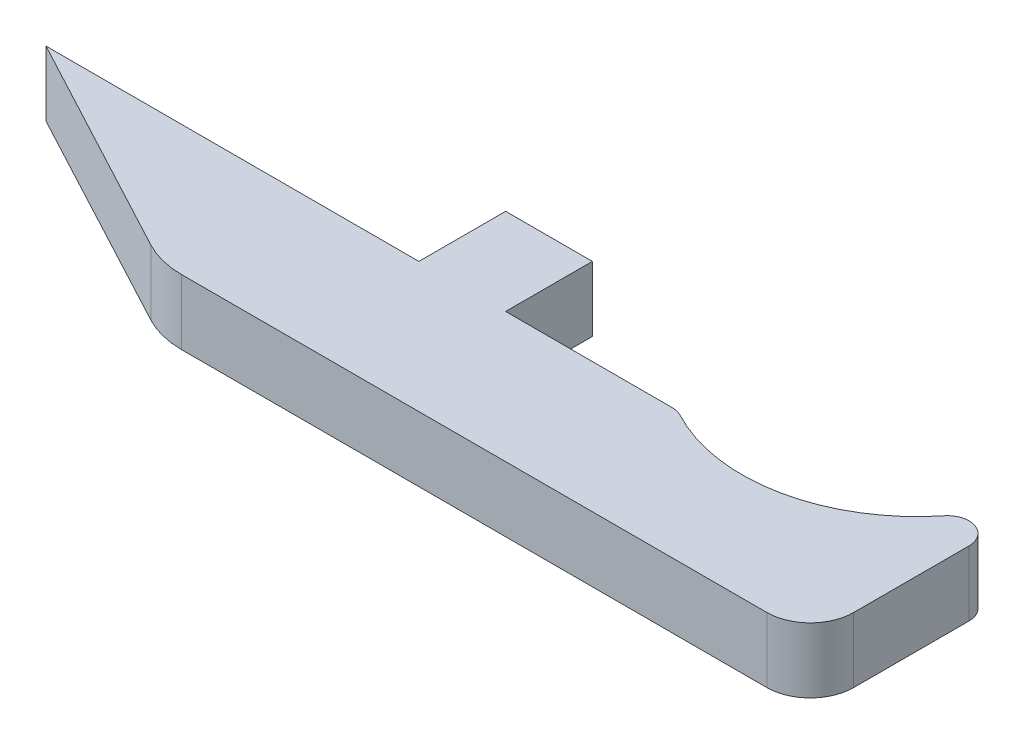
ISO-10303-21;
HEADER;
FILE_DESCRIPTION(('STEP AP214'),'2;1');
FILE_NAME('part.step','',(''),(''),'','','');
FILE_SCHEMA(('AUTOMOTIVE_DESIGN { 1 0 10303 214 1 1 1 1 }'));
ENDSEC;
DATA;
#1=APPLICATION_CONTEXT('core data for automotive mechanical design processes');
#2=APPLICATION_PROTOCOL_DEFINITION('international standard','automotive_design',2000,#1);
#3=PRODUCT_CONTEXT('',#1,'mechanical');
#4=PRODUCT('Part','Part','',(#3));
#5=PRODUCT_RELATED_PRODUCT_CATEGORY('part','',(#4));
#6=PRODUCT_DEFINITION_FORMATION('','',#4);
#7=PRODUCT_DEFINITION_CONTEXT('part definition',#1,'design');
#8=PRODUCT_DEFINITION('design','',#6,#7);
#9=PRODUCT_DEFINITION_SHAPE('','',#8);
#10=(LENGTH_UNIT() NAMED_UNIT(*) SI_UNIT(.MILLI.,.METRE.));
#11=(NAMED_UNIT(*) PLANE_ANGLE_UNIT() SI_UNIT($,.RADIAN.));
#12=(NAMED_UNIT(*) SI_UNIT($,.STERADIAN.) SOLID_ANGLE_UNIT());
#13=UNCERTAINTY_MEASURE_WITH_UNIT(LENGTH_MEASURE(1.E-05),#10,'distance_accuracy_value','');
#14=(GEOMETRIC_REPRESENTATION_CONTEXT(3) GLOBAL_UNCERTAINTY_ASSIGNED_CONTEXT((#13)) GLOBAL_UNIT_ASSIGNED_CONTEXT((#10,
#11,#12)) REPRESENTATION_CONTEXT('',''));
#15=CARTESIAN_POINT('',(0.,0.,0.));
#16=DIRECTION('',(0.,0.,1.));
#17=DIRECTION('',(1.,0.,0.));
#18=AXIS2_PLACEMENT_3D('',#15,#16,#17);
#19=CARTESIAN_POINT('',(0.,4.7625,45.8687309916866));
#20=DIRECTION('',(0.,0.,1.));
#21=DIRECTION('',(1.,0.,0.));
#22=AXIS2_PLACEMENT_3D('',#19,#20,#21);
#23=PLANE('',#22);
#24=DIRECTION('',(0.,-1.,0.));
#25=VECTOR('',#24,1.);
#26=CARTESIAN_POINT('',(39.9394999999324,4.7625,45.8687309916866));
#27=LINE('',#26,#25);
#28=CARTESIAN_POINT('',(39.9394999999324,4.7625,45.8687309916866));
#29=VERTEX_POINT('',#28);
#30=CARTESIAN_POINT('',(39.9394999999324,0.,45.8687309916866));
#31=VERTEX_POINT('',#30);
#32=EDGE_CURVE('E66',#29,#31,#27,.T.);
#33=ORIENTED_EDGE('',*,*,#32,.F.);
#34=DIRECTION('',(-1.,0.,0.));
#35=VECTOR('',#34,1.);
#36=CARTESIAN_POINT('',(0.,4.7625,45.8687309916866));
#37=LINE('',#36,#35);
#38=CARTESIAN_POINT('',(52.1487518651009,4.7625,45.8687309916866));
#39=VERTEX_POINT('',#38);
#40=EDGE_CURVE('E176',#39,#29,#37,.T.);
#41=ORIENTED_EDGE('',*,*,#40,.F.);
#42=DIRECTION('',(0.,1.,0.));
#43=VECTOR('',#42,1.);
#44=CARTESIAN_POINT('',(52.1487518651009,0.,45.8687309916866));
#45=LINE('',#44,#43);
#46=CARTESIAN_POINT('',(52.1487518651009,0.,45.8687309916866));
#47=VERTEX_POINT('',#46);
#48=EDGE_CURVE('E199',#39,#47,#45,.F.);
#49=ORIENTED_EDGE('',*,*,#48,.T.);
#50=DIRECTION('',(-1.,0.,0.));
#51=VECTOR('',#50,1.);
#52=CARTESIAN_POINT('',(0.,0.,45.8687309916866));
#53=LINE('',#52,#51);
#54=EDGE_CURVE('E188',#47,#31,#53,.T.);
#55=ORIENTED_EDGE('',*,*,#54,.T.);
#56=EDGE_LOOP('',(#33,#41,#49,#55));
#57=FACE_BOUND('',#56,.T.);
#58=ADVANCED_FACE('F43',(#57),#23,.F.);
#59=DIRECTION('',(0.,1.,0.));
#60=VECTOR('',#59,1.);
#61=CARTESIAN_POINT('',(33.5894999999324,4.7625,45.8687309916866));
#62=LINE('',#61,#60);
#63=CARTESIAN_POINT('',(33.5894999999324,0.,45.8687309916866));
#64=VERTEX_POINT('',#63);
#65=CARTESIAN_POINT('',(33.5894999999324,4.7625,45.8687309916866));
#66=VERTEX_POINT('',#65);
#67=EDGE_CURVE('E160',#64,#66,#62,.T.);
#68=ORIENTED_EDGE('',*,*,#67,.F.);
#69=CARTESIAN_POINT('',(6.28449999993243,0.,45.8687309916866));
#70=VERTEX_POINT('',#69);
#71=EDGE_CURVE('E166',#64,#70,#53,.T.);
#72=ORIENTED_EDGE('',*,*,#71,.T.);
#73=DIRECTION('',(0.,-1.,0.));
#74=VECTOR('',#73,1.);
#75=CARTESIAN_POINT('',(6.28449999993243,4.7625,45.8687309916866));
#76=LINE('',#75,#74);
#77=CARTESIAN_POINT('',(6.28449999993243,4.7625,45.8687309916866));
#78=VERTEX_POINT('',#77);
#79=EDGE_CURVE('E186',#78,#70,#76,.T.);
#80=ORIENTED_EDGE('',*,*,#79,.F.);
#81=EDGE_CURVE('E58',#66,#78,#37,.T.);
#82=ORIENTED_EDGE('',*,*,#81,.F.);
#83=EDGE_LOOP('',(#68,#72,#80,#82));
#84=FACE_BOUND('',#83,.T.);
#85=ADVANCED_FACE('F271',(#84),#23,.F.);
#86=CARTESIAN_POINT('',(58.9432399959317,4.7625,34.7435309916866));
#87=DIRECTION('',(0.,-1.,0.));
#88=DIRECTION('',(0.,0.,-1.));
#89=AXIS2_PLACEMENT_3D('',#86,#87,#88);
#90=CYLINDRICAL_SURFACE('',#89,12.827);
#91=CARTESIAN_POINT('',(58.9432399959317,0.,34.7435309916866));
#92=DIRECTION('',(0.,1.,0.));
#93=DIRECTION('',(0.,0.,1.));
#94=AXIS2_PLACEMENT_3D('',#91,#92,#93);
#95=CIRCLE('',#94,12.827);
#96=CARTESIAN_POINT('',(52.8970435094656,0.,46.0561538991756));
#97=VERTEX_POINT('',#96);
#98=CARTESIAN_POINT('',(68.944909599456,0.,42.774628932936));
#99=VERTEX_POINT('',#98);
#100=EDGE_CURVE('E163',#97,#99,#95,.T.);
#101=ORIENTED_EDGE('',*,*,#100,.F.);
#102=DIRECTION('',(0.,-1.,0.));
#103=VECTOR('',#102,1.);
#104=CARTESIAN_POINT('',(52.8970435094656,4.7625,46.0561538991756));
#105=LINE('',#104,#103);
#106=CARTESIAN_POINT('',(52.8970435094656,4.7625,46.0561538991756));
#107=VERTEX_POINT('',#106);
#108=EDGE_CURVE('E209',#97,#107,#105,.F.);
#109=ORIENTED_EDGE('',*,*,#108,.T.);
#110=CARTESIAN_POINT('',(58.9432399959317,4.7625,34.7435309916866));
#111=DIRECTION('',(0.,1.,0.));
#112=DIRECTION('',(0.,0.,1.));
#113=AXIS2_PLACEMENT_3D('',#110,#111,#112);
#114=CIRCLE('',#113,12.827);
#115=CARTESIAN_POINT('',(68.944909599456,4.7625,42.774628932936));
#116=VERTEX_POINT('',#115);
#117=EDGE_CURVE('E172',#107,#116,#114,.T.);
#118=ORIENTED_EDGE('',*,*,#117,.T.);
#119=DIRECTION('',(0.,-1.,0.));
#120=VECTOR('',#119,1.);
#121=CARTESIAN_POINT('',(68.944909599456,4.7625,42.774628932936));
#122=LINE('',#121,#120);
#123=EDGE_CURVE('E206',#116,#99,#122,.T.);
#124=ORIENTED_EDGE('',*,*,#123,.T.);
#125=EDGE_LOOP('',(#101,#109,#118,#124));
#126=FACE_BOUND('',#125,.T.);
#127=ADVANCED_FACE('F253',(#126),#90,.F.);
#128=CARTESIAN_POINT('',(-17.653471350339,4.7625,33.1027886420187));
#129=DIRECTION('',(0.470560234606516,0.,-0.88236787430587));
#130=DIRECTION('',(-0.88236787430587,0.,-0.470560234606516));
#131=AXIS2_PLACEMENT_3D('',#128,#129,#130);
#132=PLANE('',#131);
#133=DIRECTION('',(0.88236787430587,0.,0.470560234606516));
#134=VECTOR('',#133,1.);
#135=CARTESIAN_POINT('',(-17.653471350339,0.,33.1027886420187));
#136=LINE('',#135,#134);
#137=CARTESIAN_POINT('',(22.7445754544654,0.,54.6467669935289));
#138=VERTEX_POINT('',#137);
#139=EDGE_CURVE('E190',#70,#138,#136,.T.);
#140=ORIENTED_EDGE('',*,*,#139,.T.);
#141=DIRECTION('',(0.,-1.,0.));
#142=VECTOR('',#141,1.);
#143=CARTESIAN_POINT('',(22.7445754544654,4.7625,54.6467669935289));
#144=LINE('',#143,#142);
#145=CARTESIAN_POINT('',(22.7445754544654,4.7625,54.6467669935289));
#146=VERTEX_POINT('',#145);
#147=EDGE_CURVE('E222',#138,#146,#144,.F.);
#148=ORIENTED_EDGE('',*,*,#147,.T.);
#149=DIRECTION('',(0.88236787430587,0.,0.470560234606516));
#150=VECTOR('',#149,1.);
#151=CARTESIAN_POINT('',(-17.653471350339,4.7625,33.1027886420187));
#152=LINE('',#151,#150);
#153=EDGE_CURVE('E178',#78,#146,#152,.T.);
#154=ORIENTED_EDGE('',*,*,#153,.F.);
#155=ORIENTED_EDGE('',*,*,#79,.T.);
#156=EDGE_LOOP('',(#140,#148,#154,#155));
#157=FACE_BOUND('',#156,.T.);
#158=ADVANCED_FACE('F274',(#157),#132,.F.);
#159=CARTESIAN_POINT('',(0.,4.7625,55.3937309916866));
#160=DIRECTION('',(0.,0.,-1.));
#161=DIRECTION('',(-1.,0.,0.));
#162=AXIS2_PLACEMENT_3D('',#159,#160,#161);
#163=PLANE('',#162);
#164=DIRECTION('',(1.,0.,0.));
#165=VECTOR('',#164,1.);
#166=CARTESIAN_POINT('',(0.,0.,55.3937309916866));
#167=LINE('',#166,#165);
#168=CARTESIAN_POINT('',(25.7326329442167,0.,55.3937309916866));
#169=VERTEX_POINT('',#168);
#170=CARTESIAN_POINT('',(68.5952399959317,0.,55.3937309916866));
#171=VERTEX_POINT('',#170);
#172=EDGE_CURVE('E193',#169,#171,#167,.T.);
#173=ORIENTED_EDGE('',*,*,#172,.T.);
#174=DIRECTION('',(0.,-1.,0.));
#175=VECTOR('',#174,1.);
#176=CARTESIAN_POINT('',(68.5952399959317,4.7625,55.3937309916866));
#177=LINE('',#176,#175);
#178=CARTESIAN_POINT('',(68.5952399959317,4.7625,55.3937309916866));
#179=VERTEX_POINT('',#178);
#180=EDGE_CURVE('E51',#171,#179,#177,.F.);
#181=ORIENTED_EDGE('',*,*,#180,.T.);
#182=DIRECTION('',(1.,0.,0.));
#183=VECTOR('',#182,1.);
#184=CARTESIAN_POINT('',(0.,4.7625,55.3937309916866));
#185=LINE('',#184,#183);
#186=CARTESIAN_POINT('',(25.7326329442167,4.7625,55.3937309916866));
#187=VERTEX_POINT('',#186);
#188=EDGE_CURVE('E181',#187,#179,#185,.T.);
#189=ORIENTED_EDGE('',*,*,#188,.F.);
#190=DIRECTION('',(0.,-1.,0.));
#191=VECTOR('',#190,1.);
#192=CARTESIAN_POINT('',(25.7326329442167,4.7625,55.3937309916866));
#193=LINE('',#192,#191);
#194=EDGE_CURVE('E217',#187,#169,#193,.T.);
#195=ORIENTED_EDGE('',*,*,#194,.T.);
#196=EDGE_LOOP('',(#173,#181,#189,#195));
#197=FACE_BOUND('',#196,.T.);
#198=ADVANCED_FACE('F233',(#197),#163,.F.);
#199=CARTESIAN_POINT('',(71.7702399959317,4.7625,0.));
#200=DIRECTION('',(1.,0.,0.));
#201=DIRECTION('',(0.,0.,-1.));
#202=AXIS2_PLACEMENT_3D('',#199,#200,#201);
#203=PLANE('',#202);
#204=DIRECTION('',(0.,0.,1.));
#205=VECTOR('',#204,1.);
#206=CARTESIAN_POINT('',(71.7702399959317,4.7625,0.));
#207=LINE('',#206,#205);
#208=CARTESIAN_POINT('',(71.7702399959317,4.7625,43.7685766979421));
#209=VERTEX_POINT('',#208);
#210=CARTESIAN_POINT('',(71.7702399959317,4.7625,52.2187309916866));
#211=VERTEX_POINT('',#210);
#212=EDGE_CURVE('E184',#209,#211,#207,.T.);
#213=ORIENTED_EDGE('',*,*,#212,.T.);
#214=DIRECTION('',(0.,-1.,0.));
#215=VECTOR('',#214,1.);
#216=CARTESIAN_POINT('',(71.7702399959317,0.,52.2187309916866));
#217=LINE('',#216,#215);
#218=CARTESIAN_POINT('',(71.7702399959317,0.,52.2187309916866));
#219=VERTEX_POINT('',#218);
#220=EDGE_CURVE('E226',#211,#219,#217,.T.);
#221=ORIENTED_EDGE('',*,*,#220,.T.);
#222=DIRECTION('',(0.,0.,1.));
#223=VECTOR('',#222,1.);
#224=CARTESIAN_POINT('',(71.7702399959317,0.,0.));
#225=LINE('',#224,#223);
#226=CARTESIAN_POINT('',(71.7702399959317,0.,43.7685766979421));
#227=VERTEX_POINT('',#226);
#228=EDGE_CURVE('E175',#227,#219,#225,.T.);
#229=ORIENTED_EDGE('',*,*,#228,.F.);
#230=DIRECTION('',(0.,-1.,0.));
#231=VECTOR('',#230,1.);
#232=CARTESIAN_POINT('',(71.7702399959317,4.7625,43.7685766979421));
#233=LINE('',#232,#231);
#234=EDGE_CURVE('E215',#227,#209,#233,.F.);
#235=ORIENTED_EDGE('',*,*,#234,.T.);
#236=EDGE_LOOP('',(#213,#221,#229,#235));
#237=FACE_BOUND('',#236,.T.);
#238=ADVANCED_FACE('F245',(#237),#203,.T.);
#239=CARTESIAN_POINT('',(0.,4.7625,0.));
#240=DIRECTION('',(0.,1.,0.));
#241=DIRECTION('',(0.,0.,1.));
#242=AXIS2_PLACEMENT_3D('',#239,#240,#241);
#243=PLANE('',#242);
#244=ORIENTED_EDGE('',*,*,#188,.T.);
#245=CARTESIAN_POINT('',(68.5952399959317,4.7625,52.2187309916866));
#246=DIRECTION('',(0.,1.,0.));
#247=DIRECTION('',(0.,0.,1.));
#248=AXIS2_PLACEMENT_3D('',#245,#246,#247);
#249=CIRCLE('',#248,3.175);
#250=EDGE_CURVE('E11',#179,#211,#249,.T.);
#251=ORIENTED_EDGE('',*,*,#250,.T.);
#252=ORIENTED_EDGE('',*,*,#212,.F.);
#253=CARTESIAN_POINT('',(70.1827399959317,4.7625,43.7685766979421));
#254=DIRECTION('',(0.,1.,0.));
#255=DIRECTION('',(0.,0.,1.));
#256=AXIS2_PLACEMENT_3D('',#253,#254,#255);
#257=CIRCLE('',#256,1.5875);
#258=EDGE_CURVE('E211',#209,#116,#257,.T.);
#259=ORIENTED_EDGE('',*,*,#258,.T.);
#260=ORIENTED_EDGE('',*,*,#117,.F.);
#261=CARTESIAN_POINT('',(52.1487518651009,4.7625,47.4562309916866));
#262=DIRECTION('',(0.,1.,0.));
#263=DIRECTION('',(0.,0.,1.));
#264=AXIS2_PLACEMENT_3D('',#261,#262,#263);
#265=CIRCLE('',#264,1.5875);
#266=EDGE_CURVE('E213',#107,#39,#265,.T.);
#267=ORIENTED_EDGE('',*,*,#266,.T.);
#268=ORIENTED_EDGE('',*,*,#40,.T.);
#269=DIRECTION('',(0.,0.,1.));
#270=VECTOR('',#269,1.);
#271=CARTESIAN_POINT('',(39.9394999999324,4.7625,39.5187309916866));
#272=LINE('',#271,#270);
#273=CARTESIAN_POINT('',(39.9394999999324,4.7625,39.5187309916866));
#274=VERTEX_POINT('',#273);
#275=EDGE_CURVE('E260',#274,#29,#272,.T.);
#276=ORIENTED_EDGE('',*,*,#275,.F.);
#277=DIRECTION('',(1.,0.,0.));
#278=VECTOR('',#277,1.);
#279=CARTESIAN_POINT('',(39.9394999999324,4.7625,39.5187309916866));
#280=LINE('',#279,#278);
#281=CARTESIAN_POINT('',(33.5894999999324,4.7625,39.5187309916866));
#282=VERTEX_POINT('',#281);
#283=EDGE_CURVE('E156',#282,#274,#280,.T.);
#284=ORIENTED_EDGE('',*,*,#283,.F.);
#285=DIRECTION('',(0.,0.,1.));
#286=VECTOR('',#285,1.);
#287=CARTESIAN_POINT('',(33.5894999999324,4.7625,39.5187309916866));
#288=LINE('',#287,#286);
#289=EDGE_CURVE('E168',#282,#66,#288,.T.);
#290=ORIENTED_EDGE('',*,*,#289,.T.);
#291=ORIENTED_EDGE('',*,*,#81,.T.);
#292=ORIENTED_EDGE('',*,*,#153,.T.);
#293=CARTESIAN_POINT('',(25.7326329442167,4.7625,49.0437309916866));
#294=DIRECTION('',(0.,1.,0.));
#295=DIRECTION('',(0.,0.,1.));
#296=AXIS2_PLACEMENT_3D('',#293,#294,#295);
#297=CIRCLE('',#296,6.35);
#298=EDGE_CURVE('E224',#146,#187,#297,.T.);
#299=ORIENTED_EDGE('',*,*,#298,.T.);
#300=EDGE_LOOP('',(#244,#251,#252,#259,#260,#267,#268,#276,#284,#290,#291,#292,#299));
#301=FACE_BOUND('',#300,.T.);
#302=ADVANCED_FACE('F239',(#301),#243,.T.);
#303=CARTESIAN_POINT('',(0.,0.,0.));
#304=DIRECTION('',(0.,1.,0.));
#305=DIRECTION('',(0.,0.,1.));
#306=AXIS2_PLACEMENT_3D('',#303,#304,#305);
#307=PLANE('',#306);
#308=ORIENTED_EDGE('',*,*,#228,.T.);
#309=CARTESIAN_POINT('',(68.5952399959317,0.,52.2187309916866));
#310=DIRECTION('',(0.,1.,0.));
#311=DIRECTION('',(0.,0.,1.));
#312=AXIS2_PLACEMENT_3D('',#309,#310,#311);
#313=CIRCLE('',#312,3.175);
#314=EDGE_CURVE('E229',#219,#171,#313,.F.);
#315=ORIENTED_EDGE('',*,*,#314,.T.);
#316=ORIENTED_EDGE('',*,*,#172,.F.);
#317=CARTESIAN_POINT('',(25.7326329442167,0.,49.0437309916866));
#318=DIRECTION('',(0.,1.,0.));
#319=DIRECTION('',(0.,0.,1.));
#320=AXIS2_PLACEMENT_3D('',#317,#318,#319);
#321=CIRCLE('',#320,6.35);
#322=EDGE_CURVE('E220',#169,#138,#321,.F.);
#323=ORIENTED_EDGE('',*,*,#322,.T.);
#324=ORIENTED_EDGE('',*,*,#139,.F.);
#325=ORIENTED_EDGE('',*,*,#71,.F.);
#326=DIRECTION('',(0.,0.,1.));
#327=VECTOR('',#326,1.);
#328=CARTESIAN_POINT('',(33.5894999999324,0.,39.5187309916866));
#329=LINE('',#328,#327);
#330=CARTESIAN_POINT('',(33.5894999999324,0.,39.5187309916866));
#331=VERTEX_POINT('',#330);
#332=EDGE_CURVE('E147',#331,#64,#329,.T.);
#333=ORIENTED_EDGE('',*,*,#332,.F.);
#334=DIRECTION('',(-1.,0.,0.));
#335=VECTOR('',#334,1.);
#336=CARTESIAN_POINT('',(39.9394999999324,0.,39.5187309916866));
#337=LINE('',#336,#335);
#338=CARTESIAN_POINT('',(39.9394999999324,0.,39.5187309916866));
#339=VERTEX_POINT('',#338);
#340=EDGE_CURVE('E139',#339,#331,#337,.T.);
#341=ORIENTED_EDGE('',*,*,#340,.F.);
#342=DIRECTION('',(0.,0.,1.));
#343=VECTOR('',#342,1.);
#344=CARTESIAN_POINT('',(39.9394999999324,0.,39.5187309916866));
#345=LINE('',#344,#343);
#346=EDGE_CURVE('E145',#339,#31,#345,.T.);
#347=ORIENTED_EDGE('',*,*,#346,.T.);
#348=ORIENTED_EDGE('',*,*,#54,.F.);
#349=CARTESIAN_POINT('',(52.1487518651009,0.,47.4562309916866));
#350=DIRECTION('',(0.,1.,0.));
#351=DIRECTION('',(0.,0.,1.));
#352=AXIS2_PLACEMENT_3D('',#349,#350,#351);
#353=CIRCLE('',#352,1.5875);
#354=EDGE_CURVE('E204',#47,#97,#353,.F.);
#355=ORIENTED_EDGE('',*,*,#354,.T.);
#356=ORIENTED_EDGE('',*,*,#100,.T.);
#357=CARTESIAN_POINT('',(70.1827399959317,0.,43.7685766979421));
#358=DIRECTION('',(0.,1.,0.));
#359=DIRECTION('',(0.,0.,1.));
#360=AXIS2_PLACEMENT_3D('',#357,#358,#359);
#361=CIRCLE('',#360,1.5875);
#362=EDGE_CURVE('E202',#99,#227,#361,.F.);
#363=ORIENTED_EDGE('',*,*,#362,.T.);
#364=EDGE_LOOP('',(#308,#315,#316,#323,#324,#325,#333,#341,#347,#348,#355,#356,#363));
#365=FACE_BOUND('',#364,.T.);
#366=ADVANCED_FACE('F142',(#365),#307,.F.);
#367=CARTESIAN_POINT('',(52.1487518651009,4.7625,47.4562309916866));
#368=DIRECTION('',(0.,-1.,0.));
#369=DIRECTION('',(0.,0.,-1.));
#370=AXIS2_PLACEMENT_3D('',#367,#368,#369);
#371=CYLINDRICAL_SURFACE('',#370,1.5875);
#372=ORIENTED_EDGE('',*,*,#266,.F.);
#373=ORIENTED_EDGE('',*,*,#108,.F.);
#374=ORIENTED_EDGE('',*,*,#354,.F.);
#375=ORIENTED_EDGE('',*,*,#48,.F.);
#376=EDGE_LOOP('',(#372,#373,#374,#375));
#377=FACE_BOUND('',#376,.T.);
#378=ADVANCED_FACE('F259',(#377),#371,.T.);
#379=CARTESIAN_POINT('',(70.1827399959317,4.7625,43.7685766979421));
#380=DIRECTION('',(0.,-1.,0.));
#381=DIRECTION('',(0.,0.,-1.));
#382=AXIS2_PLACEMENT_3D('',#379,#380,#381);
#383=CYLINDRICAL_SURFACE('',#382,1.5875);
#384=ORIENTED_EDGE('',*,*,#258,.F.);
#385=ORIENTED_EDGE('',*,*,#234,.F.);
#386=ORIENTED_EDGE('',*,*,#362,.F.);
#387=ORIENTED_EDGE('',*,*,#123,.F.);
#388=EDGE_LOOP('',(#384,#385,#386,#387));
#389=FACE_BOUND('',#388,.T.);
#390=ADVANCED_FACE('F251',(#389),#383,.T.);
#391=CARTESIAN_POINT('',(25.7326329442167,4.7625,49.0437309916866));
#392=DIRECTION('',(0.,-1.,0.));
#393=DIRECTION('',(0.,0.,-1.));
#394=AXIS2_PLACEMENT_3D('',#391,#392,#393);
#395=CYLINDRICAL_SURFACE('',#394,6.35);
#396=ORIENTED_EDGE('',*,*,#298,.F.);
#397=ORIENTED_EDGE('',*,*,#147,.F.);
#398=ORIENTED_EDGE('',*,*,#322,.F.);
#399=ORIENTED_EDGE('',*,*,#194,.F.);
#400=EDGE_LOOP('',(#396,#397,#398,#399));
#401=FACE_BOUND('',#400,.T.);
#402=ADVANCED_FACE('F277',(#401),#395,.T.);
#403=CARTESIAN_POINT('',(68.5952399959317,4.7625,52.2187309916866));
#404=DIRECTION('',(0.,1.,0.));
#405=DIRECTION('',(0.,0.,1.));
#406=AXIS2_PLACEMENT_3D('',#403,#404,#405);
#407=CYLINDRICAL_SURFACE('',#406,3.175);
#408=ORIENTED_EDGE('',*,*,#250,.F.);
#409=ORIENTED_EDGE('',*,*,#180,.F.);
#410=ORIENTED_EDGE('',*,*,#314,.F.);
#411=ORIENTED_EDGE('',*,*,#220,.F.);
#412=EDGE_LOOP('',(#408,#409,#410,#411));
#413=FACE_BOUND('',#412,.T.);
#414=ADVANCED_FACE('F45',(#413),#407,.T.);
#415=CARTESIAN_POINT('',(39.9394999999324,4.7625,39.5187309916866));
#416=DIRECTION('',(-1.,0.,0.));
#417=DIRECTION('',(0.,0.,1.));
#418=AXIS2_PLACEMENT_3D('',#415,#416,#417);
#419=PLANE('',#418);
#420=ORIENTED_EDGE('',*,*,#32,.T.);
#421=ORIENTED_EDGE('',*,*,#346,.F.);
#422=DIRECTION('',(0.,-1.,0.));
#423=VECTOR('',#422,1.);
#424=CARTESIAN_POINT('',(39.9394999999324,4.7625,39.5187309916866));
#425=LINE('',#424,#423);
#426=EDGE_CURVE('E151',#274,#339,#425,.T.);
#427=ORIENTED_EDGE('',*,*,#426,.F.);
#428=ORIENTED_EDGE('',*,*,#275,.T.);
#429=EDGE_LOOP('',(#420,#421,#427,#428));
#430=FACE_BOUND('',#429,.T.);
#431=ADVANCED_FACE('F162',(#430),#419,.F.);
#432=CARTESIAN_POINT('',(33.5894999999324,4.7625,39.5187309916866));
#433=DIRECTION('',(1.,0.,0.));
#434=DIRECTION('',(0.,0.,-1.));
#435=AXIS2_PLACEMENT_3D('',#432,#433,#434);
#436=PLANE('',#435);
#437=ORIENTED_EDGE('',*,*,#67,.T.);
#438=ORIENTED_EDGE('',*,*,#289,.F.);
#439=DIRECTION('',(0.,1.,0.));
#440=VECTOR('',#439,1.);
#441=CARTESIAN_POINT('',(33.5894999999324,4.7625,39.5187309916866));
#442=LINE('',#441,#440);
#443=EDGE_CURVE('E150',#331,#282,#442,.T.);
#444=ORIENTED_EDGE('',*,*,#443,.F.);
#445=ORIENTED_EDGE('',*,*,#332,.T.);
#446=EDGE_LOOP('',(#437,#438,#444,#445));
#447=FACE_BOUND('',#446,.T.);
#448=ADVANCED_FACE('F269',(#447),#436,.F.);
#449=CARTESIAN_POINT('',(0.,0.,39.5187309916866));
#450=DIRECTION('',(0.,0.,-1.));
#451=DIRECTION('',(-1.,0.,0.));
#452=AXIS2_PLACEMENT_3D('',#449,#450,#451);
#453=PLANE('',#452);
#454=ORIENTED_EDGE('',*,*,#426,.T.);
#455=ORIENTED_EDGE('',*,*,#340,.T.);
#456=ORIENTED_EDGE('',*,*,#443,.T.);
#457=ORIENTED_EDGE('',*,*,#283,.T.);
#458=EDGE_LOOP('',(#454,#455,#456,#457));
#459=FACE_BOUND('',#458,.T.);
#460=ADVANCED_FACE('F154',(#459),#453,.T.);
#461=CLOSED_SHELL('',(#58,#85,#127,#158,#198,#238,#302,#366,#378,#390,#402,#414,#431,#448,#460));
#462=MANIFOLD_SOLID_BREP('B2',#461);
#463=ADVANCED_BREP_SHAPE_REPRESENTATION('',(#18,#462),#14);
#464=SHAPE_DEFINITION_REPRESENTATION(#9,#463);
ENDSEC;
END-ISO-10303-21;
